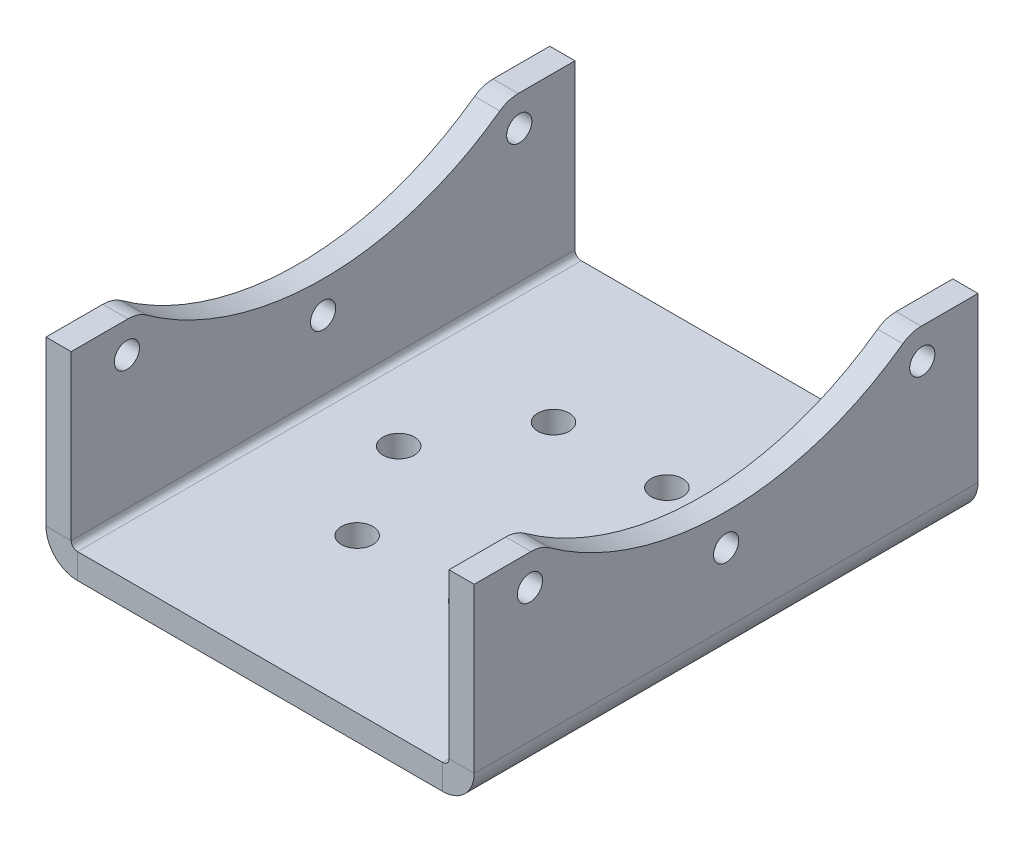
ISO-10303-21;
HEADER;
FILE_DESCRIPTION(('STEP AP214'),'2;1');
FILE_NAME('part.step','',(''),(''),'','','');
FILE_SCHEMA(('AUTOMOTIVE_DESIGN { 1 0 10303 214 1 1 1 1 }'));
ENDSEC;
DATA;
#1=APPLICATION_CONTEXT('core data for automotive mechanical design processes');
#2=APPLICATION_PROTOCOL_DEFINITION('international standard','automotive_design',2000,#1);
#3=PRODUCT_CONTEXT('',#1,'mechanical');
#4=PRODUCT('Part','Part','',(#3));
#5=PRODUCT_RELATED_PRODUCT_CATEGORY('part','',(#4));
#6=PRODUCT_DEFINITION_FORMATION('','',#4);
#7=PRODUCT_DEFINITION_CONTEXT('part definition',#1,'design');
#8=PRODUCT_DEFINITION('design','',#6,#7);
#9=PRODUCT_DEFINITION_SHAPE('','',#8);
#10=(LENGTH_UNIT() NAMED_UNIT(*) SI_UNIT(.MILLI.,.METRE.));
#11=(NAMED_UNIT(*) PLANE_ANGLE_UNIT() SI_UNIT($,.RADIAN.));
#12=(NAMED_UNIT(*) SI_UNIT($,.STERADIAN.) SOLID_ANGLE_UNIT());
#13=UNCERTAINTY_MEASURE_WITH_UNIT(LENGTH_MEASURE(1.E-05),#10,'distance_accuracy_value','');
#14=(GEOMETRIC_REPRESENTATION_CONTEXT(3) GLOBAL_UNCERTAINTY_ASSIGNED_CONTEXT((#13)) GLOBAL_UNIT_ASSIGNED_CONTEXT((#10,
#11,#12)) REPRESENTATION_CONTEXT('',''));
#15=CARTESIAN_POINT('',(0.,0.,0.));
#16=DIRECTION('',(0.,0.,1.));
#17=DIRECTION('',(1.,0.,0.));
#18=AXIS2_PLACEMENT_3D('',#15,#16,#17);
#19=CARTESIAN_POINT('',(-34.,27.,80.));
#20=DIRECTION('',(0.,1.,0.));
#21=DIRECTION('',(0.,0.,1.));
#22=AXIS2_PLACEMENT_3D('',#19,#20,#21);
#23=PLANE('',#22);
#24=DIRECTION('',(0.,0.,-1.));
#25=VECTOR('',#24,1.);
#26=CARTESIAN_POINT('',(-34.,27.,80.));
#27=LINE('',#26,#25);
#28=CARTESIAN_POINT('',(-34.,27.,9.01613323034062));
#29=VERTEX_POINT('',#28);
#30=CARTESIAN_POINT('',(-34.,27.,0.));
#31=VERTEX_POINT('',#30);
#32=EDGE_CURVE('E298',#29,#31,#27,.T.);
#33=ORIENTED_EDGE('',*,*,#32,.F.);
#34=DIRECTION('',(1.,0.,0.));
#35=VECTOR('',#34,1.);
#36=CARTESIAN_POINT('',(-30.,27.,9.01613323034061));
#37=LINE('',#36,#35);
#38=CARTESIAN_POINT('',(-30.,27.,9.01613323034062));
#39=VERTEX_POINT('',#38);
#40=EDGE_CURVE('E344',#29,#39,#37,.T.);
#41=ORIENTED_EDGE('',*,*,#40,.T.);
#42=DIRECTION('',(0.,0.,-1.));
#43=VECTOR('',#42,1.);
#44=CARTESIAN_POINT('',(-30.,27.,80.));
#45=LINE('',#44,#43);
#46=CARTESIAN_POINT('',(-30.,27.,0.));
#47=VERTEX_POINT('',#46);
#48=EDGE_CURVE('E196',#39,#47,#45,.T.);
#49=ORIENTED_EDGE('',*,*,#48,.T.);
#50=DIRECTION('',(1.,0.,0.));
#51=VECTOR('',#50,1.);
#52=CARTESIAN_POINT('',(-34.,27.,0.));
#53=LINE('',#52,#51);
#54=EDGE_CURVE('E236',#31,#47,#53,.T.);
#55=ORIENTED_EDGE('',*,*,#54,.F.);
#56=EDGE_LOOP('',(#33,#41,#49,#55));
#57=FACE_BOUND('',#56,.T.);
#58=ADVANCED_FACE('F36',(#57),#23,.T.);
#59=CARTESIAN_POINT('',(30.,27.,80.));
#60=DIRECTION('',(0.,1.,0.));
#61=DIRECTION('',(0.,0.,1.));
#62=AXIS2_PLACEMENT_3D('',#59,#60,#61);
#63=PLANE('',#62);
#64=DIRECTION('',(0.,0.,-1.));
#65=VECTOR('',#64,1.);
#66=CARTESIAN_POINT('',(30.,27.,80.));
#67=LINE('',#66,#65);
#68=CARTESIAN_POINT('',(30.,27.,9.0161332303406));
#69=VERTEX_POINT('',#68);
#70=CARTESIAN_POINT('',(30.,27.,0.));
#71=VERTEX_POINT('',#70);
#72=EDGE_CURVE('E279',#69,#71,#67,.T.);
#73=ORIENTED_EDGE('',*,*,#72,.F.);
#74=DIRECTION('',(1.,0.,0.));
#75=VECTOR('',#74,1.);
#76=CARTESIAN_POINT('',(34.,27.,9.0161332303406));
#77=LINE('',#76,#75);
#78=CARTESIAN_POINT('',(34.,27.,9.0161332303406));
#79=VERTEX_POINT('',#78);
#80=EDGE_CURVE('E61',#69,#79,#77,.T.);
#81=ORIENTED_EDGE('',*,*,#80,.T.);
#82=DIRECTION('',(0.,0.,-1.));
#83=VECTOR('',#82,1.);
#84=CARTESIAN_POINT('',(34.,27.,80.));
#85=LINE('',#84,#83);
#86=CARTESIAN_POINT('',(34.,27.,0.));
#87=VERTEX_POINT('',#86);
#88=EDGE_CURVE('E283',#79,#87,#85,.T.);
#89=ORIENTED_EDGE('',*,*,#88,.T.);
#90=DIRECTION('',(1.,0.,0.));
#91=VECTOR('',#90,1.);
#92=CARTESIAN_POINT('',(30.,27.,0.));
#93=LINE('',#92,#91);
#94=EDGE_CURVE('E255',#71,#87,#93,.T.);
#95=ORIENTED_EDGE('',*,*,#94,.F.);
#96=EDGE_LOOP('',(#73,#81,#89,#95));
#97=FACE_BOUND('',#96,.T.);
#98=ADVANCED_FACE('F426',(#97),#63,.T.);
#99=CARTESIAN_POINT('',(30.,1.00000000000001,80.));
#100=DIRECTION('',(0.,0.,1.));
#101=DIRECTION('',(1.,0.,0.));
#102=AXIS2_PLACEMENT_3D('',#99,#100,#101);
#103=PLANE('',#102);
#104=DIRECTION('',(1.,0.,0.));
#105=VECTOR('',#104,1.);
#106=CARTESIAN_POINT('',(30.,1.00000000000001,80.));
#107=LINE('',#106,#105);
#108=CARTESIAN_POINT('',(30.,1.00000000000001,80.));
#109=VERTEX_POINT('',#108);
#110=CARTESIAN_POINT('',(34.,1.00000000000001,80.));
#111=VERTEX_POINT('',#110);
#112=EDGE_CURVE('E312',#109,#111,#107,.T.);
#113=ORIENTED_EDGE('',*,*,#112,.F.);
#114=CARTESIAN_POINT('',(29.,1.00000000000001,80.));
#115=DIRECTION('',(0.,0.,1.));
#116=DIRECTION('',(1.,0.,0.));
#117=AXIS2_PLACEMENT_3D('',#114,#115,#116);
#118=CIRCLE('',#117,1.);
#119=CARTESIAN_POINT('',(29.,0.,80.));
#120=VERTEX_POINT('',#119);
#121=EDGE_CURVE('E224',#109,#120,#118,.F.);
#122=ORIENTED_EDGE('',*,*,#121,.T.);
#123=DIRECTION('',(0.,1.,0.));
#124=VECTOR('',#123,1.);
#125=CARTESIAN_POINT('',(29.,-3.99999999999999,80.));
#126=LINE('',#125,#124);
#127=CARTESIAN_POINT('',(29.,-3.99999999999999,80.));
#128=VERTEX_POINT('',#127);
#129=EDGE_CURVE('E310',#128,#120,#126,.T.);
#130=ORIENTED_EDGE('',*,*,#129,.F.);
#131=CARTESIAN_POINT('',(29.,1.00000000000001,80.));
#132=DIRECTION('',(0.,0.,1.));
#133=DIRECTION('',(1.,0.,0.));
#134=AXIS2_PLACEMENT_3D('',#131,#132,#133);
#135=CIRCLE('',#134,5.);
#136=EDGE_CURVE('E212',#111,#128,#135,.F.);
#137=ORIENTED_EDGE('',*,*,#136,.F.);
#138=EDGE_LOOP('',(#113,#122,#130,#137));
#139=FACE_BOUND('',#138,.T.);
#140=ADVANCED_FACE('F432',(#139),#103,.T.);
#141=CARTESIAN_POINT('',(29.,-3.99999999999999,80.));
#142=DIRECTION('',(0.,0.,1.));
#143=DIRECTION('',(1.,0.,0.));
#144=AXIS2_PLACEMENT_3D('',#141,#142,#143);
#145=PLANE('',#144);
#146=DIRECTION('',(0.,-1.,0.));
#147=VECTOR('',#146,1.);
#148=CARTESIAN_POINT('',(30.,0.,80.));
#149=LINE('',#148,#147);
#150=CARTESIAN_POINT('',(30.,27.,80.));
#151=VERTEX_POINT('',#150);
#152=EDGE_CURVE('E221',#151,#109,#149,.T.);
#153=ORIENTED_EDGE('',*,*,#152,.T.);
#154=ORIENTED_EDGE('',*,*,#112,.T.);
#155=DIRECTION('',(0.,1.,0.));
#156=VECTOR('',#155,1.);
#157=CARTESIAN_POINT('',(34.,0.,80.));
#158=LINE('',#157,#156);
#159=CARTESIAN_POINT('',(34.,27.,80.));
#160=VERTEX_POINT('',#159);
#161=EDGE_CURVE('E215',#160,#111,#158,.F.);
#162=ORIENTED_EDGE('',*,*,#161,.F.);
#163=DIRECTION('',(1.,0.,0.));
#164=VECTOR('',#163,1.);
#165=CARTESIAN_POINT('',(30.,27.,80.));
#166=LINE('',#165,#164);
#167=EDGE_CURVE('E218',#151,#160,#166,.T.);
#168=ORIENTED_EDGE('',*,*,#167,.F.);
#169=EDGE_LOOP('',(#153,#154,#162,#168));
#170=FACE_BOUND('',#169,.T.);
#171=ADVANCED_FACE('F472',(#170),#145,.T.);
#172=CARTESIAN_POINT('',(29.,0.,0.));
#173=DIRECTION('',(0.,0.,-1.));
#174=DIRECTION('',(-1.,0.,0.));
#175=AXIS2_PLACEMENT_3D('',#172,#173,#174);
#176=PLANE('',#175);
#177=DIRECTION('',(0.,-1.,0.));
#178=VECTOR('',#177,1.);
#179=CARTESIAN_POINT('',(29.,0.,0.));
#180=LINE('',#179,#178);
#181=CARTESIAN_POINT('',(29.,0.,0.));
#182=VERTEX_POINT('',#181);
#183=CARTESIAN_POINT('',(29.,-3.99999999999999,0.));
#184=VERTEX_POINT('',#183);
#185=EDGE_CURVE('E308',#182,#184,#180,.T.);
#186=ORIENTED_EDGE('',*,*,#185,.F.);
#187=CARTESIAN_POINT('',(29.,1.00000000000001,0.));
#188=DIRECTION('',(0.,0.,1.));
#189=DIRECTION('',(1.,0.,0.));
#190=AXIS2_PLACEMENT_3D('',#187,#188,#189);
#191=CIRCLE('',#190,1.);
#192=CARTESIAN_POINT('',(30.,1.00000000000001,0.));
#193=VERTEX_POINT('',#192);
#194=EDGE_CURVE('E261',#193,#182,#191,.F.);
#195=ORIENTED_EDGE('',*,*,#194,.F.);
#196=DIRECTION('',(-1.,0.,0.));
#197=VECTOR('',#196,1.);
#198=CARTESIAN_POINT('',(34.,1.00000000000001,0.));
#199=LINE('',#198,#197);
#200=CARTESIAN_POINT('',(34.,1.00000000000001,0.));
#201=VERTEX_POINT('',#200);
#202=EDGE_CURVE('E306',#201,#193,#199,.T.);
#203=ORIENTED_EDGE('',*,*,#202,.F.);
#204=CARTESIAN_POINT('',(29.,1.00000000000001,0.));
#205=DIRECTION('',(0.,0.,1.));
#206=DIRECTION('',(1.,0.,0.));
#207=AXIS2_PLACEMENT_3D('',#204,#205,#206);
#208=CIRCLE('',#207,5.);
#209=EDGE_CURVE('E249',#201,#184,#208,.F.);
#210=ORIENTED_EDGE('',*,*,#209,.T.);
#211=EDGE_LOOP('',(#186,#195,#203,#210));
#212=FACE_BOUND('',#211,.T.);
#213=ADVANCED_FACE('F468',(#212),#176,.T.);
#214=CARTESIAN_POINT('',(34.,1.00000000000001,0.));
#215=DIRECTION('',(0.,0.,-1.));
#216=DIRECTION('',(-1.,0.,0.));
#217=AXIS2_PLACEMENT_3D('',#214,#215,#216);
#218=PLANE('',#217);
#219=DIRECTION('',(-1.,0.,0.));
#220=VECTOR('',#219,1.);
#221=CARTESIAN_POINT('',(-30.,0.,0.));
#222=LINE('',#221,#220);
#223=CARTESIAN_POINT('',(-29.,0.,0.));
#224=VERTEX_POINT('',#223);
#225=EDGE_CURVE('E264',#182,#224,#222,.T.);
#226=ORIENTED_EDGE('',*,*,#225,.F.);
#227=ORIENTED_EDGE('',*,*,#185,.T.);
#228=DIRECTION('',(-1.,0.,0.));
#229=VECTOR('',#228,1.);
#230=CARTESIAN_POINT('',(-30.,-4.,0.));
#231=LINE('',#230,#229);
#232=CARTESIAN_POINT('',(-29.,-4.,0.));
#233=VERTEX_POINT('',#232);
#234=EDGE_CURVE('E246',#184,#233,#231,.T.);
#235=ORIENTED_EDGE('',*,*,#234,.T.);
#236=DIRECTION('',(0.,1.,0.));
#237=VECTOR('',#236,1.);
#238=CARTESIAN_POINT('',(-29.,-4.,0.));
#239=LINE('',#238,#237);
#240=EDGE_CURVE('E195',#233,#224,#239,.T.);
#241=ORIENTED_EDGE('',*,*,#240,.T.);
#242=EDGE_LOOP('',(#226,#227,#235,#241));
#243=FACE_BOUND('',#242,.T.);
#244=ADVANCED_FACE('F464',(#243),#218,.T.);
#245=CARTESIAN_POINT('',(-29.,0.,80.));
#246=DIRECTION('',(0.,0.,1.));
#247=DIRECTION('',(1.,0.,0.));
#248=AXIS2_PLACEMENT_3D('',#245,#246,#247);
#249=PLANE('',#248);
#250=DIRECTION('',(0.,-1.,0.));
#251=VECTOR('',#250,1.);
#252=CARTESIAN_POINT('',(-29.,0.,80.));
#253=LINE('',#252,#251);
#254=CARTESIAN_POINT('',(-29.,0.,80.));
#255=VERTEX_POINT('',#254);
#256=CARTESIAN_POINT('',(-29.,-4.,80.));
#257=VERTEX_POINT('',#256);
#258=EDGE_CURVE('E304',#255,#257,#253,.T.);
#259=ORIENTED_EDGE('',*,*,#258,.F.);
#260=CARTESIAN_POINT('',(-29.,1.,80.));
#261=DIRECTION('',(0.,0.,1.));
#262=DIRECTION('',(1.,0.,0.));
#263=AXIS2_PLACEMENT_3D('',#260,#261,#262);
#264=CIRCLE('',#263,1.);
#265=CARTESIAN_POINT('',(-30.,1.,80.));
#266=VERTEX_POINT('',#265);
#267=EDGE_CURVE('E230',#255,#266,#264,.F.);
#268=ORIENTED_EDGE('',*,*,#267,.T.);
#269=DIRECTION('',(1.,0.,0.));
#270=VECTOR('',#269,1.);
#271=CARTESIAN_POINT('',(-34.,1.,80.));
#272=LINE('',#271,#270);
#273=CARTESIAN_POINT('',(-34.,1.,80.));
#274=VERTEX_POINT('',#273);
#275=EDGE_CURVE('E182',#274,#266,#272,.T.);
#276=ORIENTED_EDGE('',*,*,#275,.F.);
#277=CARTESIAN_POINT('',(-29.,1.,80.));
#278=DIRECTION('',(0.,0.,1.));
#279=DIRECTION('',(1.,0.,0.));
#280=AXIS2_PLACEMENT_3D('',#277,#278,#279);
#281=CIRCLE('',#280,5.);
#282=EDGE_CURVE('E203',#257,#274,#281,.F.);
#283=ORIENTED_EDGE('',*,*,#282,.F.);
#284=EDGE_LOOP('',(#259,#268,#276,#283));
#285=FACE_BOUND('',#284,.T.);
#286=ADVANCED_FACE('F460',(#285),#249,.T.);
#287=CARTESIAN_POINT('',(-34.,1.,80.));
#288=DIRECTION('',(0.,0.,1.));
#289=DIRECTION('',(1.,0.,0.));
#290=AXIS2_PLACEMENT_3D('',#287,#288,#289);
#291=PLANE('',#290);
#292=DIRECTION('',(-1.,0.,0.));
#293=VECTOR('',#292,1.);
#294=CARTESIAN_POINT('',(-30.,0.,80.));
#295=LINE('',#294,#293);
#296=EDGE_CURVE('E227',#120,#255,#295,.T.);
#297=ORIENTED_EDGE('',*,*,#296,.T.);
#298=ORIENTED_EDGE('',*,*,#258,.T.);
#299=DIRECTION('',(-1.,0.,0.));
#300=VECTOR('',#299,1.);
#301=CARTESIAN_POINT('',(-30.,-4.,80.));
#302=LINE('',#301,#300);
#303=EDGE_CURVE('E209',#128,#257,#302,.T.);
#304=ORIENTED_EDGE('',*,*,#303,.F.);
#305=ORIENTED_EDGE('',*,*,#129,.T.);
#306=EDGE_LOOP('',(#297,#298,#304,#305));
#307=FACE_BOUND('',#306,.T.);
#308=ADVANCED_FACE('F456',(#307),#291,.T.);
#309=CARTESIAN_POINT('',(-30.,1.,0.));
#310=DIRECTION('',(0.,0.,-1.));
#311=DIRECTION('',(-1.,0.,0.));
#312=AXIS2_PLACEMENT_3D('',#309,#310,#311);
#313=PLANE('',#312);
#314=DIRECTION('',(-1.,0.,0.));
#315=VECTOR('',#314,1.);
#316=CARTESIAN_POINT('',(-30.,1.,0.));
#317=LINE('',#316,#315);
#318=CARTESIAN_POINT('',(-30.,1.,0.));
#319=VERTEX_POINT('',#318);
#320=CARTESIAN_POINT('',(-34.,1.,0.));
#321=VERTEX_POINT('',#320);
#322=EDGE_CURVE('E301',#319,#321,#317,.T.);
#323=ORIENTED_EDGE('',*,*,#322,.F.);
#324=CARTESIAN_POINT('',(-29.,1.,0.));
#325=DIRECTION('',(0.,0.,1.));
#326=DIRECTION('',(1.,0.,0.));
#327=AXIS2_PLACEMENT_3D('',#324,#325,#326);
#328=CIRCLE('',#327,1.);
#329=EDGE_CURVE('E186',#224,#319,#328,.F.);
#330=ORIENTED_EDGE('',*,*,#329,.F.);
#331=ORIENTED_EDGE('',*,*,#240,.F.);
#332=CARTESIAN_POINT('',(-29.,1.,0.));
#333=DIRECTION('',(0.,0.,1.));
#334=DIRECTION('',(1.,0.,0.));
#335=AXIS2_PLACEMENT_3D('',#332,#333,#334);
#336=CIRCLE('',#335,5.);
#337=EDGE_CURVE('E243',#233,#321,#336,.F.);
#338=ORIENTED_EDGE('',*,*,#337,.T.);
#339=EDGE_LOOP('',(#323,#330,#331,#338));
#340=FACE_BOUND('',#339,.T.);
#341=ADVANCED_FACE('F450',(#340),#313,.T.);
#342=CARTESIAN_POINT('',(-29.,-4.,0.));
#343=DIRECTION('',(0.,0.,-1.));
#344=DIRECTION('',(-1.,0.,0.));
#345=AXIS2_PLACEMENT_3D('',#342,#343,#344);
#346=PLANE('',#345);
#347=DIRECTION('',(0.,1.,0.));
#348=VECTOR('',#347,1.);
#349=CARTESIAN_POINT('',(-30.,0.,0.));
#350=LINE('',#349,#348);
#351=EDGE_CURVE('E233',#319,#47,#350,.T.);
#352=ORIENTED_EDGE('',*,*,#351,.F.);
#353=ORIENTED_EDGE('',*,*,#322,.T.);
#354=DIRECTION('',(0.,1.,0.));
#355=VECTOR('',#354,1.);
#356=CARTESIAN_POINT('',(-34.,0.,0.));
#357=LINE('',#356,#355);
#358=EDGE_CURVE('E240',#321,#31,#357,.T.);
#359=ORIENTED_EDGE('',*,*,#358,.T.);
#360=ORIENTED_EDGE('',*,*,#54,.T.);
#361=EDGE_LOOP('',(#352,#353,#359,#360));
#362=FACE_BOUND('',#361,.T.);
#363=ADVANCED_FACE('F446',(#362),#346,.T.);
#364=CARTESIAN_POINT('',(-30.,0.,80.));
#365=DIRECTION('',(-1.,0.,0.));
#366=DIRECTION('',(0.,0.,1.));
#367=AXIS2_PLACEMENT_3D('',#364,#365,#366);
#368=PLANE('',#367);
#369=CARTESIAN_POINT('',(-30.,22.1220992981278,71.1526183715011));
#370=DIRECTION('',(-1.,0.,0.));
#371=DIRECTION('',(0.,0.,1.));
#372=AXIS2_PLACEMENT_3D('',#369,#370,#371);
#373=CIRCLE('',#372,2.);
#374=CARTESIAN_POINT('',(-30.,22.1220992981278,73.1526183715011));
#375=VERTEX_POINT('',#374);
#376=EDGE_CURVE('E237',#375,#375,#373,.T.);
#377=ORIENTED_EDGE('',*,*,#376,.T.);
#378=EDGE_LOOP('',(#377));
#379=FACE_BOUND('',#378,.T.);
#380=CARTESIAN_POINT('',(-30.,22.1220992981278,8.84738162849893));
#381=DIRECTION('',(-1.,0.,0.));
#382=DIRECTION('',(0.,0.,1.));
#383=AXIS2_PLACEMENT_3D('',#380,#381,#382);
#384=CIRCLE('',#383,2.00000000000001);
#385=CARTESIAN_POINT('',(-30.,22.1220992981278,10.8473816284989));
#386=VERTEX_POINT('',#385);
#387=EDGE_CURVE('E326',#386,#386,#384,.T.);
#388=ORIENTED_EDGE('',*,*,#387,.T.);
#389=EDGE_LOOP('',(#388));
#390=FACE_BOUND('',#389,.T.);
#391=CARTESIAN_POINT('',(-30.,12.,40.));
#392=DIRECTION('',(-1.,0.,0.));
#393=DIRECTION('',(0.,0.,1.));
#394=AXIS2_PLACEMENT_3D('',#391,#392,#393);
#395=CIRCLE('',#394,1.99999999999998);
#396=CARTESIAN_POINT('',(-30.,12.,42.));
#397=VERTEX_POINT('',#396);
#398=EDGE_CURVE('E321',#397,#397,#395,.T.);
#399=ORIENTED_EDGE('',*,*,#398,.T.);
#400=EDGE_LOOP('',(#399));
#401=FACE_BOUND('',#400,.T.);
#402=CARTESIAN_POINT('',(-30.,65.,40.));
#403=DIRECTION('',(-1.,0.,0.));
#404=DIRECTION('',(0.,0.,1.));
#405=AXIS2_PLACEMENT_3D('',#402,#403,#404);
#406=CIRCLE('',#405,48.);
#407=CARTESIAN_POINT('',(-30.,26.0566037735849,11.9391395293651));
#408=VERTEX_POINT('',#407);
#409=CARTESIAN_POINT('',(-30.,26.0566037735849,68.0608604706349));
#410=VERTEX_POINT('',#409);
#411=EDGE_CURVE('E322',#408,#410,#406,.T.);
#412=ORIENTED_EDGE('',*,*,#411,.T.);
#413=CARTESIAN_POINT('',(-30.,22.,70.9838667696594));
#414=DIRECTION('',(-1.,0.,0.));
#415=DIRECTION('',(0.,0.,1.));
#416=AXIS2_PLACEMENT_3D('',#413,#414,#415);
#417=CIRCLE('',#416,5.);
#418=CARTESIAN_POINT('',(-30.,27.,70.9838667696594));
#419=VERTEX_POINT('',#418);
#420=EDGE_CURVE('E192',#410,#419,#417,.F.);
#421=ORIENTED_EDGE('',*,*,#420,.T.);
#422=CARTESIAN_POINT('',(-30.,27.,80.));
#423=VERTEX_POINT('',#422);
#424=EDGE_CURVE('E189',#423,#419,#45,.T.);
#425=ORIENTED_EDGE('',*,*,#424,.F.);
#426=DIRECTION('',(0.,1.,0.));
#427=VECTOR('',#426,1.);
#428=CARTESIAN_POINT('',(-30.,0.,80.));
#429=LINE('',#428,#427);
#430=EDGE_CURVE('E175',#266,#423,#429,.T.);
#431=ORIENTED_EDGE('',*,*,#430,.F.);
#432=DIRECTION('',(0.,0.,-1.));
#433=VECTOR('',#432,1.);
#434=CARTESIAN_POINT('',(-30.,1.,80.));
#435=LINE('',#434,#433);
#436=EDGE_CURVE('E232',#266,#319,#435,.T.);
#437=ORIENTED_EDGE('',*,*,#436,.T.);
#438=ORIENTED_EDGE('',*,*,#351,.T.);
#439=ORIENTED_EDGE('',*,*,#48,.F.);
#440=CARTESIAN_POINT('',(-30.,22.,9.01613323034061));
#441=DIRECTION('',(-1.,0.,0.));
#442=DIRECTION('',(0.,0.,1.));
#443=AXIS2_PLACEMENT_3D('',#440,#441,#442);
#444=CIRCLE('',#443,5.);
#445=EDGE_CURVE('E335',#39,#408,#444,.F.);
#446=ORIENTED_EDGE('',*,*,#445,.T.);
#447=EDGE_LOOP('',(#412,#421,#425,#431,#437,#438,#439,#446));
#448=FACE_BOUND('',#447,.T.);
#449=ADVANCED_FACE('F191',(#379,#390,#401,#448),#368,.F.);
#450=ORIENTED_EDGE('',*,*,#424,.T.);
#451=DIRECTION('',(1.,0.,0.));
#452=VECTOR('',#451,1.);
#453=CARTESIAN_POINT('',(-34.,27.,70.9838667696594));
#454=LINE('',#453,#452);
#455=CARTESIAN_POINT('',(-34.,27.,70.9838667696594));
#456=VERTEX_POINT('',#455);
#457=EDGE_CURVE('E338',#419,#456,#454,.F.);
#458=ORIENTED_EDGE('',*,*,#457,.T.);
#459=CARTESIAN_POINT('',(-34.,27.,80.));
#460=VERTEX_POINT('',#459);
#461=EDGE_CURVE('E200',#460,#456,#27,.T.);
#462=ORIENTED_EDGE('',*,*,#461,.F.);
#463=DIRECTION('',(1.,0.,0.));
#464=VECTOR('',#463,1.);
#465=CARTESIAN_POINT('',(-34.,27.,80.));
#466=LINE('',#465,#464);
#467=EDGE_CURVE('E180',#460,#423,#466,.T.);
#468=ORIENTED_EDGE('',*,*,#467,.T.);
#469=EDGE_LOOP('',(#450,#458,#462,#468));
#470=FACE_BOUND('',#469,.T.);
#471=ADVANCED_FACE('F198',(#470),#23,.T.);
#472=CARTESIAN_POINT('',(-34.,0.,80.));
#473=DIRECTION('',(-1.,0.,0.));
#474=DIRECTION('',(0.,0.,1.));
#475=AXIS2_PLACEMENT_3D('',#472,#473,#474);
#476=PLANE('',#475);
#477=CARTESIAN_POINT('',(-34.,22.1220992981278,71.1526183715011));
#478=DIRECTION('',(-1.,0.,0.));
#479=DIRECTION('',(0.,0.,1.));
#480=AXIS2_PLACEMENT_3D('',#477,#478,#479);
#481=CIRCLE('',#480,2.);
#482=CARTESIAN_POINT('',(-34.,22.1220992981278,73.1526183715011));
#483=VERTEX_POINT('',#482);
#484=EDGE_CURVE('E376',#483,#483,#481,.T.);
#485=ORIENTED_EDGE('',*,*,#484,.F.);
#486=EDGE_LOOP('',(#485));
#487=FACE_BOUND('',#486,.T.);
#488=CARTESIAN_POINT('',(-34.,22.1220992981278,8.84738162849893));
#489=DIRECTION('',(-1.,0.,0.));
#490=DIRECTION('',(0.,0.,1.));
#491=AXIS2_PLACEMENT_3D('',#488,#489,#490);
#492=CIRCLE('',#491,2.00000000000001);
#493=CARTESIAN_POINT('',(-34.,22.1220992981278,10.8473816284989));
#494=VERTEX_POINT('',#493);
#495=EDGE_CURVE('E385',#494,#494,#492,.T.);
#496=ORIENTED_EDGE('',*,*,#495,.F.);
#497=EDGE_LOOP('',(#496));
#498=FACE_BOUND('',#497,.T.);
#499=CARTESIAN_POINT('',(-34.,12.,40.));
#500=DIRECTION('',(-1.,0.,0.));
#501=DIRECTION('',(0.,0.,1.));
#502=AXIS2_PLACEMENT_3D('',#499,#500,#501);
#503=CIRCLE('',#502,1.99999999999998);
#504=CARTESIAN_POINT('',(-34.,12.,42.));
#505=VERTEX_POINT('',#504);
#506=EDGE_CURVE('E950',#505,#505,#503,.T.);
#507=ORIENTED_EDGE('',*,*,#506,.F.);
#508=EDGE_LOOP('',(#507));
#509=FACE_BOUND('',#508,.T.);
#510=ORIENTED_EDGE('',*,*,#461,.T.);
#511=CARTESIAN_POINT('',(-34.,22.,70.9838667696594));
#512=DIRECTION('',(-1.,0.,0.));
#513=DIRECTION('',(0.,0.,1.));
#514=AXIS2_PLACEMENT_3D('',#511,#512,#513);
#515=CIRCLE('',#514,5.);
#516=CARTESIAN_POINT('',(-34.,26.0566037735849,68.0608604706349));
#517=VERTEX_POINT('',#516);
#518=EDGE_CURVE('E342',#456,#517,#515,.T.);
#519=ORIENTED_EDGE('',*,*,#518,.T.);
#520=CARTESIAN_POINT('',(-34.,65.,40.));
#521=DIRECTION('',(-1.,0.,0.));
#522=DIRECTION('',(0.,0.,1.));
#523=AXIS2_PLACEMENT_3D('',#520,#521,#522);
#524=CIRCLE('',#523,48.);
#525=CARTESIAN_POINT('',(-34.,26.0566037735849,11.9391395293651));
#526=VERTEX_POINT('',#525);
#527=EDGE_CURVE('E391',#526,#517,#524,.T.);
#528=ORIENTED_EDGE('',*,*,#527,.F.);
#529=CARTESIAN_POINT('',(-34.,22.,9.01613323034061));
#530=DIRECTION('',(-1.,0.,0.));
#531=DIRECTION('',(0.,0.,1.));
#532=AXIS2_PLACEMENT_3D('',#529,#530,#531);
#533=CIRCLE('',#532,5.);
#534=EDGE_CURVE('E340',#526,#29,#533,.T.);
#535=ORIENTED_EDGE('',*,*,#534,.T.);
#536=ORIENTED_EDGE('',*,*,#32,.T.);
#537=ORIENTED_EDGE('',*,*,#358,.F.);
#538=DIRECTION('',(0.,0.,-1.));
#539=VECTOR('',#538,1.);
#540=CARTESIAN_POINT('',(-34.,1.,80.));
#541=LINE('',#540,#539);
#542=EDGE_CURVE('E295',#274,#321,#541,.T.);
#543=ORIENTED_EDGE('',*,*,#542,.F.);
#544=DIRECTION('',(0.,1.,0.));
#545=VECTOR('',#544,1.);
#546=CARTESIAN_POINT('',(-34.,0.,80.));
#547=LINE('',#546,#545);
#548=EDGE_CURVE('E201',#274,#460,#547,.T.);
#549=ORIENTED_EDGE('',*,*,#548,.T.);
#550=EDGE_LOOP('',(#510,#519,#528,#535,#536,#537,#543,#549));
#551=FACE_BOUND('',#550,.T.);
#552=ADVANCED_FACE('F439',(#487,#498,#509,#551),#476,.T.);
#553=CARTESIAN_POINT('',(-29.,1.,80.));
#554=DIRECTION('',(0.,0.,-1.));
#555=DIRECTION('',(-1.,0.,0.));
#556=AXIS2_PLACEMENT_3D('',#553,#554,#555);
#557=CYLINDRICAL_SURFACE('',#556,5.);
#558=ORIENTED_EDGE('',*,*,#337,.F.);
#559=DIRECTION('',(0.,0.,-1.));
#560=VECTOR('',#559,1.);
#561=CARTESIAN_POINT('',(-29.,-4.,80.));
#562=LINE('',#561,#560);
#563=EDGE_CURVE('E292',#257,#233,#562,.T.);
#564=ORIENTED_EDGE('',*,*,#563,.F.);
#565=ORIENTED_EDGE('',*,*,#282,.T.);
#566=ORIENTED_EDGE('',*,*,#542,.T.);
#567=EDGE_LOOP('',(#558,#564,#565,#566));
#568=FACE_BOUND('',#567,.T.);
#569=ADVANCED_FACE('F444',(#568),#557,.T.);
#570=CARTESIAN_POINT('',(-30.,-4.,80.));
#571=DIRECTION('',(0.,-1.,0.));
#572=DIRECTION('',(1.,0.,0.));
#573=AXIS2_PLACEMENT_3D('',#570,#571,#572);
#574=PLANE('',#573);
#575=CARTESIAN_POINT('',(-18.,-4.,40.));
#576=DIRECTION('',(0.,-1.,0.));
#577=DIRECTION('',(1.,0.,0.));
#578=AXIS2_PLACEMENT_3D('',#575,#576,#577);
#579=CIRCLE('',#578,2.5);
#580=CARTESIAN_POINT('',(-15.5,-4.,40.));
#581=VERTEX_POINT('',#580);
#582=EDGE_CURVE('E363',#581,#581,#579,.T.);
#583=ORIENTED_EDGE('',*,*,#582,.F.);
#584=EDGE_LOOP('',(#583));
#585=FACE_BOUND('',#584,.T.);
#586=CARTESIAN_POINT('',(8.99999999999999,-3.99999999999999,55.5884572681199));
#587=DIRECTION('',(0.,-1.,0.));
#588=DIRECTION('',(1.,0.,0.));
#589=AXIS2_PLACEMENT_3D('',#586,#587,#588);
#590=CIRCLE('',#589,2.5);
#591=CARTESIAN_POINT('',(11.5,-3.99999999999999,55.5884572681199));
#592=VERTEX_POINT('',#591);
#593=EDGE_CURVE('E937',#592,#592,#590,.T.);
#594=ORIENTED_EDGE('',*,*,#593,.F.);
#595=EDGE_LOOP('',(#594));
#596=FACE_BOUND('',#595,.T.);
#597=CARTESIAN_POINT('',(-8.99999999999998,-4.,24.4115427318801));
#598=DIRECTION('',(0.,-1.,0.));
#599=DIRECTION('',(1.,0.,0.));
#600=AXIS2_PLACEMENT_3D('',#597,#598,#599);
#601=CIRCLE('',#600,2.5);
#602=CARTESIAN_POINT('',(-6.49999999999998,-4.,24.4115427318801));
#603=VERTEX_POINT('',#602);
#604=EDGE_CURVE('E939',#603,#603,#601,.T.);
#605=ORIENTED_EDGE('',*,*,#604,.F.);
#606=EDGE_LOOP('',(#605));
#607=FACE_BOUND('',#606,.T.);
#608=CARTESIAN_POINT('',(9.00000000000001,-3.99999999999999,24.4115427318801));
#609=DIRECTION('',(0.,-1.,0.));
#610=DIRECTION('',(1.,0.,0.));
#611=AXIS2_PLACEMENT_3D('',#608,#609,#610);
#612=CIRCLE('',#611,2.5);
#613=CARTESIAN_POINT('',(11.5,-3.99999999999999,24.4115427318801));
#614=VERTEX_POINT('',#613);
#615=EDGE_CURVE('E943',#614,#614,#612,.T.);
#616=ORIENTED_EDGE('',*,*,#615,.F.);
#617=EDGE_LOOP('',(#616));
#618=FACE_BOUND('',#617,.T.);
#619=CARTESIAN_POINT('',(18.,-3.99999999999999,40.));
#620=DIRECTION('',(0.,-1.,0.));
#621=DIRECTION('',(1.,0.,0.));
#622=AXIS2_PLACEMENT_3D('',#619,#620,#621);
#623=CIRCLE('',#622,2.5);
#624=CARTESIAN_POINT('',(20.5,-3.99999999999999,40.));
#625=VERTEX_POINT('',#624);
#626=EDGE_CURVE('E934',#625,#625,#623,.T.);
#627=ORIENTED_EDGE('',*,*,#626,.F.);
#628=EDGE_LOOP('',(#627));
#629=FACE_BOUND('',#628,.T.);
#630=CARTESIAN_POINT('',(-9.00000000000001,-4.,55.5884572681199));
#631=DIRECTION('',(0.,-1.,0.));
#632=DIRECTION('',(1.,0.,0.));
#633=AXIS2_PLACEMENT_3D('',#630,#631,#632);
#634=CIRCLE('',#633,2.5);
#635=CARTESIAN_POINT('',(-6.5,-4.,55.5884572681199));
#636=VERTEX_POINT('',#635);
#637=EDGE_CURVE('E931',#636,#636,#634,.T.);
#638=ORIENTED_EDGE('',*,*,#637,.F.);
#639=EDGE_LOOP('',(#638));
#640=FACE_BOUND('',#639,.T.);
#641=ORIENTED_EDGE('',*,*,#234,.F.);
#642=DIRECTION('',(0.,0.,-1.));
#643=VECTOR('',#642,1.);
#644=CARTESIAN_POINT('',(29.,-3.99999999999999,80.));
#645=LINE('',#644,#643);
#646=EDGE_CURVE('E289',#128,#184,#645,.T.);
#647=ORIENTED_EDGE('',*,*,#646,.F.);
#648=ORIENTED_EDGE('',*,*,#303,.T.);
#649=ORIENTED_EDGE('',*,*,#563,.T.);
#650=EDGE_LOOP('',(#641,#647,#648,#649));
#651=FACE_BOUND('',#650,.T.);
#652=ADVANCED_FACE('F586',(#585,#596,#607,#618,#629,#640,#651),#574,.T.);
#653=CARTESIAN_POINT('',(29.,1.00000000000001,80.));
#654=DIRECTION('',(0.,0.,-1.));
#655=DIRECTION('',(-1.,0.,0.));
#656=AXIS2_PLACEMENT_3D('',#653,#654,#655);
#657=CYLINDRICAL_SURFACE('',#656,5.);
#658=ORIENTED_EDGE('',*,*,#209,.F.);
#659=DIRECTION('',(0.,0.,-1.));
#660=VECTOR('',#659,1.);
#661=CARTESIAN_POINT('',(34.,1.00000000000001,80.));
#662=LINE('',#661,#660);
#663=EDGE_CURVE('E286',#111,#201,#662,.T.);
#664=ORIENTED_EDGE('',*,*,#663,.F.);
#665=ORIENTED_EDGE('',*,*,#136,.T.);
#666=ORIENTED_EDGE('',*,*,#646,.T.);
#667=EDGE_LOOP('',(#658,#664,#665,#666));
#668=FACE_BOUND('',#667,.T.);
#669=ADVANCED_FACE('F513',(#668),#657,.T.);
#670=CARTESIAN_POINT('',(34.,0.,80.));
#671=DIRECTION('',(1.,0.,0.));
#672=DIRECTION('',(0.,0.,-1.));
#673=AXIS2_PLACEMENT_3D('',#670,#671,#672);
#674=PLANE('',#673);
#675=CARTESIAN_POINT('',(34.,22.1220992981278,71.1526183715011));
#676=DIRECTION('',(-1.,0.,0.));
#677=DIRECTION('',(0.,0.,1.));
#678=AXIS2_PLACEMENT_3D('',#675,#676,#677);
#679=CIRCLE('',#678,2.);
#680=CARTESIAN_POINT('',(34.,22.1220992981278,73.1526183715011));
#681=VERTEX_POINT('',#680);
#682=EDGE_CURVE('E380',#681,#681,#679,.T.);
#683=ORIENTED_EDGE('',*,*,#682,.T.);
#684=EDGE_LOOP('',(#683));
#685=FACE_BOUND('',#684,.T.);
#686=CARTESIAN_POINT('',(34.,22.1220992981278,8.84738162849893));
#687=DIRECTION('',(-1.,0.,0.));
#688=DIRECTION('',(0.,0.,1.));
#689=AXIS2_PLACEMENT_3D('',#686,#687,#688);
#690=CIRCLE('',#689,2.00000000000001);
#691=CARTESIAN_POINT('',(34.,22.1220992981278,10.8473816284989));
#692=VERTEX_POINT('',#691);
#693=EDGE_CURVE('E953',#692,#692,#690,.T.);
#694=ORIENTED_EDGE('',*,*,#693,.T.);
#695=EDGE_LOOP('',(#694));
#696=FACE_BOUND('',#695,.T.);
#697=CARTESIAN_POINT('',(34.,12.,40.));
#698=DIRECTION('',(-1.,0.,0.));
#699=DIRECTION('',(0.,0.,1.));
#700=AXIS2_PLACEMENT_3D('',#697,#698,#699);
#701=CIRCLE('',#700,1.99999999999998);
#702=CARTESIAN_POINT('',(34.,12.,42.));
#703=VERTEX_POINT('',#702);
#704=EDGE_CURVE('E394',#703,#703,#701,.T.);
#705=ORIENTED_EDGE('',*,*,#704,.T.);
#706=EDGE_LOOP('',(#705));
#707=FACE_BOUND('',#706,.T.);
#708=ORIENTED_EDGE('',*,*,#88,.F.);
#709=CARTESIAN_POINT('',(34.,22.,9.0161332303406));
#710=DIRECTION('',(1.,0.,0.));
#711=DIRECTION('',(0.,0.,-1.));
#712=AXIS2_PLACEMENT_3D('',#709,#710,#711);
#713=CIRCLE('',#712,5.);
#714=CARTESIAN_POINT('',(34.,26.0566037735849,11.9391395293651));
#715=VERTEX_POINT('',#714);
#716=EDGE_CURVE('E45',#79,#715,#713,.T.);
#717=ORIENTED_EDGE('',*,*,#716,.T.);
#718=CARTESIAN_POINT('',(34.,65.,40.));
#719=DIRECTION('',(-1.,0.,0.));
#720=DIRECTION('',(0.,0.,1.));
#721=AXIS2_PLACEMENT_3D('',#718,#719,#720);
#722=CIRCLE('',#721,48.);
#723=CARTESIAN_POINT('',(34.,26.0566037735849,68.0608604706349));
#724=VERTEX_POINT('',#723);
#725=EDGE_CURVE('E389',#715,#724,#722,.T.);
#726=ORIENTED_EDGE('',*,*,#725,.T.);
#727=CARTESIAN_POINT('',(34.,22.,70.9838667696594));
#728=DIRECTION('',(1.,0.,0.));
#729=DIRECTION('',(0.,0.,-1.));
#730=AXIS2_PLACEMENT_3D('',#727,#728,#729);
#731=CIRCLE('',#730,5.);
#732=CARTESIAN_POINT('',(34.,27.,70.9838667696594));
#733=VERTEX_POINT('',#732);
#734=EDGE_CURVE('E53',#724,#733,#731,.T.);
#735=ORIENTED_EDGE('',*,*,#734,.T.);
#736=EDGE_CURVE('E284',#160,#733,#85,.T.);
#737=ORIENTED_EDGE('',*,*,#736,.F.);
#738=ORIENTED_EDGE('',*,*,#161,.T.);
#739=ORIENTED_EDGE('',*,*,#663,.T.);
#740=DIRECTION('',(0.,1.,0.));
#741=VECTOR('',#740,1.);
#742=CARTESIAN_POINT('',(34.,0.,0.));
#743=LINE('',#742,#741);
#744=EDGE_CURVE('E252',#87,#201,#743,.F.);
#745=ORIENTED_EDGE('',*,*,#744,.F.);
#746=EDGE_LOOP('',(#708,#717,#726,#735,#737,#738,#739,#745));
#747=FACE_BOUND('',#746,.T.);
#748=ADVANCED_FACE('F493',(#685,#696,#707,#747),#674,.T.);
#749=ORIENTED_EDGE('',*,*,#736,.T.);
#750=DIRECTION('',(1.,0.,0.));
#751=VECTOR('',#750,1.);
#752=CARTESIAN_POINT('',(30.,27.,70.9838667696594));
#753=LINE('',#752,#751);
#754=CARTESIAN_POINT('',(30.,27.,70.9838667696594));
#755=VERTEX_POINT('',#754);
#756=EDGE_CURVE('E11',#733,#755,#753,.F.);
#757=ORIENTED_EDGE('',*,*,#756,.T.);
#758=EDGE_CURVE('E280',#151,#755,#67,.T.);
#759=ORIENTED_EDGE('',*,*,#758,.F.);
#760=ORIENTED_EDGE('',*,*,#167,.T.);
#761=EDGE_LOOP('',(#749,#757,#759,#760));
#762=FACE_BOUND('',#761,.T.);
#763=ADVANCED_FACE('F434',(#762),#63,.T.);
#764=CARTESIAN_POINT('',(30.,0.,80.));
#765=DIRECTION('',(1.,0.,0.));
#766=DIRECTION('',(0.,0.,-1.));
#767=AXIS2_PLACEMENT_3D('',#764,#765,#766);
#768=PLANE('',#767);
#769=CARTESIAN_POINT('',(30.,22.1220992981278,71.1526183715011));
#770=DIRECTION('',(1.,0.,0.));
#771=DIRECTION('',(0.,0.,-1.));
#772=AXIS2_PLACEMENT_3D('',#769,#770,#771);
#773=CIRCLE('',#772,2.);
#774=CARTESIAN_POINT('',(30.,22.1220992981278,69.1526183715011));
#775=VERTEX_POINT('',#774);
#776=EDGE_CURVE('E327',#775,#775,#773,.T.);
#777=ORIENTED_EDGE('',*,*,#776,.T.);
#778=EDGE_LOOP('',(#777));
#779=FACE_BOUND('',#778,.T.);
#780=CARTESIAN_POINT('',(30.,22.1220992981278,8.84738162849893));
#781=DIRECTION('',(1.,0.,0.));
#782=DIRECTION('',(0.,0.,-1.));
#783=AXIS2_PLACEMENT_3D('',#780,#781,#782);
#784=CIRCLE('',#783,2.00000000000001);
#785=CARTESIAN_POINT('',(30.,22.1220992981278,6.84738162849891));
#786=VERTEX_POINT('',#785);
#787=EDGE_CURVE('E323',#786,#786,#784,.T.);
#788=ORIENTED_EDGE('',*,*,#787,.T.);
#789=EDGE_LOOP('',(#788));
#790=FACE_BOUND('',#789,.T.);
#791=CARTESIAN_POINT('',(30.,12.,40.));
#792=DIRECTION('',(1.,0.,0.));
#793=DIRECTION('',(0.,0.,-1.));
#794=AXIS2_PLACEMENT_3D('',#791,#792,#793);
#795=CIRCLE('',#794,1.99999999999998);
#796=CARTESIAN_POINT('',(30.,12.,38.));
#797=VERTEX_POINT('',#796);
#798=EDGE_CURVE('E318',#797,#797,#795,.T.);
#799=ORIENTED_EDGE('',*,*,#798,.T.);
#800=EDGE_LOOP('',(#799));
#801=FACE_BOUND('',#800,.T.);
#802=CARTESIAN_POINT('',(30.,65.,40.));
#803=DIRECTION('',(1.,0.,0.));
#804=DIRECTION('',(0.,0.,-1.));
#805=AXIS2_PLACEMENT_3D('',#802,#803,#804);
#806=CIRCLE('',#805,48.);
#807=CARTESIAN_POINT('',(30.,26.0566037735849,68.0608604706349));
#808=VERTEX_POINT('',#807);
#809=CARTESIAN_POINT('',(30.,26.0566037735849,11.9391395293651));
#810=VERTEX_POINT('',#809);
#811=EDGE_CURVE('E314',#808,#810,#806,.T.);
#812=ORIENTED_EDGE('',*,*,#811,.T.);
#813=CARTESIAN_POINT('',(30.,22.,9.0161332303406));
#814=DIRECTION('',(1.,0.,0.));
#815=DIRECTION('',(0.,0.,-1.));
#816=AXIS2_PLACEMENT_3D('',#813,#814,#815);
#817=CIRCLE('',#816,5.);
#818=EDGE_CURVE('E354',#810,#69,#817,.F.);
#819=ORIENTED_EDGE('',*,*,#818,.T.);
#820=ORIENTED_EDGE('',*,*,#72,.T.);
#821=DIRECTION('',(0.,-1.,0.));
#822=VECTOR('',#821,1.);
#823=CARTESIAN_POINT('',(30.,0.,0.));
#824=LINE('',#823,#822);
#825=EDGE_CURVE('E258',#71,#193,#824,.T.);
#826=ORIENTED_EDGE('',*,*,#825,.T.);
#827=DIRECTION('',(0.,0.,-1.));
#828=VECTOR('',#827,1.);
#829=CARTESIAN_POINT('',(30.,1.00000000000001,80.));
#830=LINE('',#829,#828);
#831=EDGE_CURVE('E276',#109,#193,#830,.T.);
#832=ORIENTED_EDGE('',*,*,#831,.F.);
#833=ORIENTED_EDGE('',*,*,#152,.F.);
#834=ORIENTED_EDGE('',*,*,#758,.T.);
#835=CARTESIAN_POINT('',(30.,22.,70.9838667696594));
#836=DIRECTION('',(1.,0.,0.));
#837=DIRECTION('',(0.,0.,-1.));
#838=AXIS2_PLACEMENT_3D('',#835,#836,#837);
#839=CIRCLE('',#838,5.);
#840=EDGE_CURVE('E352',#755,#808,#839,.F.);
#841=ORIENTED_EDGE('',*,*,#840,.T.);
#842=EDGE_LOOP('',(#812,#819,#820,#826,#832,#833,#834,#841));
#843=FACE_BOUND('',#842,.T.);
#844=ADVANCED_FACE('F504',(#779,#790,#801,#843),#768,.F.);
#845=CARTESIAN_POINT('',(29.,1.00000000000001,80.));
#846=DIRECTION('',(0.,0.,-1.));
#847=DIRECTION('',(-1.,0.,0.));
#848=AXIS2_PLACEMENT_3D('',#845,#846,#847);
#849=CYLINDRICAL_SURFACE('',#848,1.);
#850=ORIENTED_EDGE('',*,*,#194,.T.);
#851=DIRECTION('',(0.,0.,-1.));
#852=VECTOR('',#851,1.);
#853=CARTESIAN_POINT('',(29.,0.,80.));
#854=LINE('',#853,#852);
#855=EDGE_CURVE('E273',#120,#182,#854,.T.);
#856=ORIENTED_EDGE('',*,*,#855,.F.);
#857=ORIENTED_EDGE('',*,*,#121,.F.);
#858=ORIENTED_EDGE('',*,*,#831,.T.);
#859=EDGE_LOOP('',(#850,#856,#857,#858));
#860=FACE_BOUND('',#859,.T.);
#861=ADVANCED_FACE('F522',(#860),#849,.F.);
#862=CARTESIAN_POINT('',(-30.,0.,80.));
#863=DIRECTION('',(0.,-1.,0.));
#864=DIRECTION('',(1.,0.,0.));
#865=AXIS2_PLACEMENT_3D('',#862,#863,#864);
#866=PLANE('',#865);
#867=CARTESIAN_POINT('',(-18.,0.,40.));
#868=DIRECTION('',(0.,-1.,0.));
#869=DIRECTION('',(1.,0.,0.));
#870=AXIS2_PLACEMENT_3D('',#867,#868,#869);
#871=CIRCLE('',#870,2.5);
#872=CARTESIAN_POINT('',(-15.5,0.,40.));
#873=VERTEX_POINT('',#872);
#874=EDGE_CURVE('E40',#873,#873,#871,.T.);
#875=ORIENTED_EDGE('',*,*,#874,.T.);
#876=EDGE_LOOP('',(#875));
#877=FACE_BOUND('',#876,.T.);
#878=CARTESIAN_POINT('',(8.99999999999999,0.,55.5884572681199));
#879=DIRECTION('',(0.,-1.,0.));
#880=DIRECTION('',(1.,0.,0.));
#881=AXIS2_PLACEMENT_3D('',#878,#879,#880);
#882=CIRCLE('',#881,2.5);
#883=CARTESIAN_POINT('',(11.5,0.,55.5884572681199));
#884=VERTEX_POINT('',#883);
#885=EDGE_CURVE('E371',#884,#884,#882,.T.);
#886=ORIENTED_EDGE('',*,*,#885,.T.);
#887=EDGE_LOOP('',(#886));
#888=FACE_BOUND('',#887,.T.);
#889=CARTESIAN_POINT('',(-8.99999999999998,0.,24.4115427318801));
#890=DIRECTION('',(0.,-1.,0.));
#891=DIRECTION('',(1.,0.,0.));
#892=AXIS2_PLACEMENT_3D('',#889,#890,#891);
#893=CIRCLE('',#892,2.5);
#894=CARTESIAN_POINT('',(-6.49999999999998,0.,24.4115427318801));
#895=VERTEX_POINT('',#894);
#896=EDGE_CURVE('E369',#895,#895,#893,.T.);
#897=ORIENTED_EDGE('',*,*,#896,.T.);
#898=EDGE_LOOP('',(#897));
#899=FACE_BOUND('',#898,.T.);
#900=CARTESIAN_POINT('',(9.00000000000001,0.,24.4115427318801));
#901=DIRECTION('',(0.,-1.,0.));
#902=DIRECTION('',(1.,0.,0.));
#903=AXIS2_PLACEMENT_3D('',#900,#901,#902);
#904=CIRCLE('',#903,2.5);
#905=CARTESIAN_POINT('',(11.5,0.,24.4115427318801));
#906=VERTEX_POINT('',#905);
#907=EDGE_CURVE('E366',#906,#906,#904,.T.);
#908=ORIENTED_EDGE('',*,*,#907,.T.);
#909=EDGE_LOOP('',(#908));
#910=FACE_BOUND('',#909,.T.);
#911=CARTESIAN_POINT('',(18.,0.,40.));
#912=DIRECTION('',(0.,-1.,0.));
#913=DIRECTION('',(1.,0.,0.));
#914=AXIS2_PLACEMENT_3D('',#911,#912,#913);
#915=CIRCLE('',#914,2.5);
#916=CARTESIAN_POINT('',(20.5,0.,40.));
#917=VERTEX_POINT('',#916);
#918=EDGE_CURVE('E362',#917,#917,#915,.T.);
#919=ORIENTED_EDGE('',*,*,#918,.T.);
#920=EDGE_LOOP('',(#919));
#921=FACE_BOUND('',#920,.T.);
#922=CARTESIAN_POINT('',(-9.00000000000001,0.,55.5884572681199));
#923=DIRECTION('',(0.,-1.,0.));
#924=DIRECTION('',(1.,0.,0.));
#925=AXIS2_PLACEMENT_3D('',#922,#923,#924);
#926=CIRCLE('',#925,2.5);
#927=CARTESIAN_POINT('',(-6.5,0.,55.5884572681199));
#928=VERTEX_POINT('',#927);
#929=EDGE_CURVE('E359',#928,#928,#926,.T.);
#930=ORIENTED_EDGE('',*,*,#929,.T.);
#931=EDGE_LOOP('',(#930));
#932=FACE_BOUND('',#931,.T.);
#933=ORIENTED_EDGE('',*,*,#225,.T.);
#934=DIRECTION('',(0.,0.,-1.));
#935=VECTOR('',#934,1.);
#936=CARTESIAN_POINT('',(-29.,0.,80.));
#937=LINE('',#936,#935);
#938=EDGE_CURVE('E270',#255,#224,#937,.T.);
#939=ORIENTED_EDGE('',*,*,#938,.F.);
#940=ORIENTED_EDGE('',*,*,#296,.F.);
#941=ORIENTED_EDGE('',*,*,#855,.T.);
#942=EDGE_LOOP('',(#933,#939,#940,#941));
#943=FACE_BOUND('',#942,.T.);
#944=ADVANCED_FACE('F527',(#877,#888,#899,#910,#921,#932,#943),#866,.F.);
#945=CARTESIAN_POINT('',(-29.,1.,80.));
#946=DIRECTION('',(0.,0.,-1.));
#947=DIRECTION('',(-1.,0.,0.));
#948=AXIS2_PLACEMENT_3D('',#945,#946,#947);
#949=CYLINDRICAL_SURFACE('',#948,1.);
#950=ORIENTED_EDGE('',*,*,#329,.T.);
#951=ORIENTED_EDGE('',*,*,#436,.F.);
#952=ORIENTED_EDGE('',*,*,#267,.F.);
#953=ORIENTED_EDGE('',*,*,#938,.T.);
#954=EDGE_LOOP('',(#950,#951,#952,#953));
#955=FACE_BOUND('',#954,.T.);
#956=ADVANCED_FACE('F532',(#955),#949,.F.);
#957=CARTESIAN_POINT('',(-29.,1.,80.));
#958=DIRECTION('',(0.,0.,1.));
#959=DIRECTION('',(1.,0.,0.));
#960=AXIS2_PLACEMENT_3D('',#957,#958,#959);
#961=PLANE('',#960);
#962=ORIENTED_EDGE('',*,*,#430,.T.);
#963=ORIENTED_EDGE('',*,*,#467,.F.);
#964=ORIENTED_EDGE('',*,*,#548,.F.);
#965=ORIENTED_EDGE('',*,*,#275,.T.);
#966=EDGE_LOOP('',(#962,#963,#964,#965));
#967=FACE_BOUND('',#966,.T.);
#968=ADVANCED_FACE('F177',(#967),#961,.T.);
#969=CARTESIAN_POINT('',(-29.,1.,0.));
#970=DIRECTION('',(0.,0.,1.));
#971=DIRECTION('',(1.,0.,0.));
#972=AXIS2_PLACEMENT_3D('',#969,#970,#971);
#973=PLANE('',#972);
#974=ORIENTED_EDGE('',*,*,#744,.T.);
#975=ORIENTED_EDGE('',*,*,#202,.T.);
#976=ORIENTED_EDGE('',*,*,#825,.F.);
#977=ORIENTED_EDGE('',*,*,#94,.T.);
#978=EDGE_LOOP('',(#974,#975,#976,#977));
#979=FACE_BOUND('',#978,.T.);
#980=ADVANCED_FACE('F517',(#979),#973,.F.);
#981=CARTESIAN_POINT('',(34.,65.,40.));
#982=DIRECTION('',(-1.,0.,0.));
#983=DIRECTION('',(0.,0.,1.));
#984=AXIS2_PLACEMENT_3D('',#981,#982,#983);
#985=CYLINDRICAL_SURFACE('',#984,48.);
#986=ORIENTED_EDGE('',*,*,#725,.F.);
#987=DIRECTION('',(-1.,0.,0.));
#988=VECTOR('',#987,1.);
#989=CARTESIAN_POINT('',(34.,26.0566037735849,11.9391395293651));
#990=LINE('',#989,#988);
#991=EDGE_CURVE('E349',#715,#810,#990,.T.);
#992=ORIENTED_EDGE('',*,*,#991,.T.);
#993=ORIENTED_EDGE('',*,*,#811,.F.);
#994=DIRECTION('',(-1.,0.,0.));
#995=VECTOR('',#994,1.);
#996=CARTESIAN_POINT('',(34.,26.0566037735849,68.0608604706349));
#997=LINE('',#996,#995);
#998=EDGE_CURVE('E346',#808,#724,#997,.F.);
#999=ORIENTED_EDGE('',*,*,#998,.T.);
#1000=EDGE_LOOP('',(#986,#992,#993,#999));
#1001=FACE_BOUND('',#1000,.T.);
#1002=ADVANCED_FACE('F496',(#1001),#985,.F.);
#1003=CARTESIAN_POINT('',(34.,12.,40.));
#1004=DIRECTION('',(-1.,0.,0.));
#1005=DIRECTION('',(0.,0.,1.));
#1006=AXIS2_PLACEMENT_3D('',#1003,#1004,#1005);
#1007=CYLINDRICAL_SURFACE('',#1006,1.99999999999998);
#1008=ORIENTED_EDGE('',*,*,#704,.F.);
#1009=EDGE_LOOP('',(#1008));
#1010=FACE_BOUND('',#1009,.T.);
#1011=ORIENTED_EDGE('',*,*,#798,.F.);
#1012=EDGE_LOOP('',(#1011));
#1013=FACE_BOUND('',#1012,.T.);
#1014=ADVANCED_FACE('F558',(#1010,#1013),#1007,.F.);
#1015=CARTESIAN_POINT('',(34.,22.1220992981278,8.84738162849893));
#1016=DIRECTION('',(-1.,0.,0.));
#1017=DIRECTION('',(0.,0.,1.));
#1018=AXIS2_PLACEMENT_3D('',#1015,#1016,#1017);
#1019=CYLINDRICAL_SURFACE('',#1018,2.00000000000001);
#1020=ORIENTED_EDGE('',*,*,#693,.F.);
#1021=EDGE_LOOP('',(#1020));
#1022=FACE_BOUND('',#1021,.T.);
#1023=ORIENTED_EDGE('',*,*,#787,.F.);
#1024=EDGE_LOOP('',(#1023));
#1025=FACE_BOUND('',#1024,.T.);
#1026=ADVANCED_FACE('F420',(#1022,#1025),#1019,.F.);
#1027=CARTESIAN_POINT('',(34.,22.1220992981278,71.1526183715011));
#1028=DIRECTION('',(-1.,0.,0.));
#1029=DIRECTION('',(0.,0.,1.));
#1030=AXIS2_PLACEMENT_3D('',#1027,#1028,#1029);
#1031=CYLINDRICAL_SURFACE('',#1030,2.);
#1032=ORIENTED_EDGE('',*,*,#682,.F.);
#1033=EDGE_LOOP('',(#1032));
#1034=FACE_BOUND('',#1033,.T.);
#1035=ORIENTED_EDGE('',*,*,#776,.F.);
#1036=EDGE_LOOP('',(#1035));
#1037=FACE_BOUND('',#1036,.T.);
#1038=ADVANCED_FACE('F409',(#1034,#1037),#1031,.F.);
#1039=ORIENTED_EDGE('',*,*,#527,.T.);
#1040=DIRECTION('',(-1.,0.,0.));
#1041=VECTOR('',#1040,1.);
#1042=CARTESIAN_POINT('',(34.,26.0566037735849,68.0608604706349));
#1043=LINE('',#1042,#1041);
#1044=EDGE_CURVE('E332',#517,#410,#1043,.F.);
#1045=ORIENTED_EDGE('',*,*,#1044,.T.);
#1046=ORIENTED_EDGE('',*,*,#411,.F.);
#1047=DIRECTION('',(-1.,0.,0.));
#1048=VECTOR('',#1047,1.);
#1049=CARTESIAN_POINT('',(34.,26.0566037735849,11.9391395293651));
#1050=LINE('',#1049,#1048);
#1051=EDGE_CURVE('E317',#408,#526,#1050,.T.);
#1052=ORIENTED_EDGE('',*,*,#1051,.T.);
#1053=EDGE_LOOP('',(#1039,#1045,#1046,#1052));
#1054=FACE_BOUND('',#1053,.T.);
#1055=ADVANCED_FACE('F423',(#1054),#985,.F.);
#1056=ORIENTED_EDGE('',*,*,#506,.T.);
#1057=EDGE_LOOP('',(#1056));
#1058=FACE_BOUND('',#1057,.T.);
#1059=ORIENTED_EDGE('',*,*,#398,.F.);
#1060=EDGE_LOOP('',(#1059));
#1061=FACE_BOUND('',#1060,.T.);
#1062=ADVANCED_FACE('F417',(#1058,#1061),#1007,.F.);
#1063=ORIENTED_EDGE('',*,*,#495,.T.);
#1064=EDGE_LOOP('',(#1063));
#1065=FACE_BOUND('',#1064,.T.);
#1066=ORIENTED_EDGE('',*,*,#387,.F.);
#1067=EDGE_LOOP('',(#1066));
#1068=FACE_BOUND('',#1067,.T.);
#1069=ADVANCED_FACE('F407',(#1065,#1068),#1019,.F.);
#1070=ORIENTED_EDGE('',*,*,#484,.T.);
#1071=EDGE_LOOP('',(#1070));
#1072=FACE_BOUND('',#1071,.T.);
#1073=ORIENTED_EDGE('',*,*,#376,.F.);
#1074=EDGE_LOOP('',(#1073));
#1075=FACE_BOUND('',#1074,.T.);
#1076=ADVANCED_FACE('F404',(#1072,#1075),#1031,.F.);
#1077=CARTESIAN_POINT('',(34.,22.,70.9838667696594));
#1078=DIRECTION('',(-1.,0.,0.));
#1079=DIRECTION('',(0.,0.,1.));
#1080=AXIS2_PLACEMENT_3D('',#1077,#1078,#1079);
#1081=CYLINDRICAL_SURFACE('',#1080,5.);
#1082=ORIENTED_EDGE('',*,*,#518,.F.);
#1083=ORIENTED_EDGE('',*,*,#457,.F.);
#1084=ORIENTED_EDGE('',*,*,#420,.F.);
#1085=ORIENTED_EDGE('',*,*,#1044,.F.);
#1086=EDGE_LOOP('',(#1082,#1083,#1084,#1085));
#1087=FACE_BOUND('',#1086,.T.);
#1088=ADVANCED_FACE('F406',(#1087),#1081,.T.);
#1089=CARTESIAN_POINT('',(34.,22.,9.01613323034061));
#1090=DIRECTION('',(-1.,0.,0.));
#1091=DIRECTION('',(0.,0.,1.));
#1092=AXIS2_PLACEMENT_3D('',#1089,#1090,#1091);
#1093=CYLINDRICAL_SURFACE('',#1092,5.);
#1094=ORIENTED_EDGE('',*,*,#445,.F.);
#1095=ORIENTED_EDGE('',*,*,#40,.F.);
#1096=ORIENTED_EDGE('',*,*,#534,.F.);
#1097=ORIENTED_EDGE('',*,*,#1051,.F.);
#1098=EDGE_LOOP('',(#1094,#1095,#1096,#1097));
#1099=FACE_BOUND('',#1098,.T.);
#1100=ADVANCED_FACE('F414',(#1099),#1093,.T.);
#1101=CARTESIAN_POINT('',(34.,22.,9.0161332303406));
#1102=DIRECTION('',(-1.,0.,0.));
#1103=DIRECTION('',(0.,0.,1.));
#1104=AXIS2_PLACEMENT_3D('',#1101,#1102,#1103);
#1105=CYLINDRICAL_SURFACE('',#1104,5.);
#1106=ORIENTED_EDGE('',*,*,#716,.F.);
#1107=ORIENTED_EDGE('',*,*,#80,.F.);
#1108=ORIENTED_EDGE('',*,*,#818,.F.);
#1109=ORIENTED_EDGE('',*,*,#991,.F.);
#1110=EDGE_LOOP('',(#1106,#1107,#1108,#1109));
#1111=FACE_BOUND('',#1110,.T.);
#1112=ADVANCED_FACE('F481',(#1111),#1105,.T.);
#1113=CARTESIAN_POINT('',(34.,22.,70.9838667696594));
#1114=DIRECTION('',(-1.,0.,0.));
#1115=DIRECTION('',(0.,0.,1.));
#1116=AXIS2_PLACEMENT_3D('',#1113,#1114,#1115);
#1117=CYLINDRICAL_SURFACE('',#1116,5.);
#1118=ORIENTED_EDGE('',*,*,#840,.F.);
#1119=ORIENTED_EDGE('',*,*,#756,.F.);
#1120=ORIENTED_EDGE('',*,*,#734,.F.);
#1121=ORIENTED_EDGE('',*,*,#998,.F.);
#1122=EDGE_LOOP('',(#1118,#1119,#1120,#1121));
#1123=FACE_BOUND('',#1122,.T.);
#1124=ADVANCED_FACE('F38',(#1123),#1117,.T.);
#1125=CARTESIAN_POINT('',(-9.00000000000001,27.,55.5884572681199));
#1126=DIRECTION('',(0.,-1.,0.));
#1127=DIRECTION('',(1.,0.,0.));
#1128=AXIS2_PLACEMENT_3D('',#1125,#1126,#1127);
#1129=CYLINDRICAL_SURFACE('',#1128,2.5);
#1130=ORIENTED_EDGE('',*,*,#637,.T.);
#1131=EDGE_LOOP('',(#1130));
#1132=FACE_BOUND('',#1131,.T.);
#1133=ORIENTED_EDGE('',*,*,#929,.F.);
#1134=EDGE_LOOP('',(#1133));
#1135=FACE_BOUND('',#1134,.T.);
#1136=ADVANCED_FACE('F488',(#1132,#1135),#1129,.F.);
#1137=CARTESIAN_POINT('',(18.,27.,40.));
#1138=DIRECTION('',(0.,-1.,0.));
#1139=DIRECTION('',(1.,0.,0.));
#1140=AXIS2_PLACEMENT_3D('',#1137,#1138,#1139);
#1141=CYLINDRICAL_SURFACE('',#1140,2.5);
#1142=ORIENTED_EDGE('',*,*,#626,.T.);
#1143=EDGE_LOOP('',(#1142));
#1144=FACE_BOUND('',#1143,.T.);
#1145=ORIENTED_EDGE('',*,*,#918,.F.);
#1146=EDGE_LOOP('',(#1145));
#1147=FACE_BOUND('',#1146,.T.);
#1148=ADVANCED_FACE('F855',(#1144,#1147),#1141,.F.);
#1149=CARTESIAN_POINT('',(9.00000000000001,27.,24.4115427318801));
#1150=DIRECTION('',(0.,-1.,0.));
#1151=DIRECTION('',(1.,0.,0.));
#1152=AXIS2_PLACEMENT_3D('',#1149,#1150,#1151);
#1153=CYLINDRICAL_SURFACE('',#1152,2.5);
#1154=ORIENTED_EDGE('',*,*,#615,.T.);
#1155=EDGE_LOOP('',(#1154));
#1156=FACE_BOUND('',#1155,.T.);
#1157=ORIENTED_EDGE('',*,*,#907,.F.);
#1158=EDGE_LOOP('',(#1157));
#1159=FACE_BOUND('',#1158,.T.);
#1160=ADVANCED_FACE('F862',(#1156,#1159),#1153,.F.);
#1161=CARTESIAN_POINT('',(-8.99999999999999,27.,24.4115427318801));
#1162=DIRECTION('',(0.,-1.,0.));
#1163=DIRECTION('',(1.,0.,0.));
#1164=AXIS2_PLACEMENT_3D('',#1161,#1162,#1163);
#1165=CYLINDRICAL_SURFACE('',#1164,2.5);
#1166=ORIENTED_EDGE('',*,*,#604,.T.);
#1167=EDGE_LOOP('',(#1166));
#1168=FACE_BOUND('',#1167,.T.);
#1169=ORIENTED_EDGE('',*,*,#896,.F.);
#1170=EDGE_LOOP('',(#1169));
#1171=FACE_BOUND('',#1170,.T.);
#1172=ADVANCED_FACE('F870',(#1168,#1171),#1165,.F.);
#1173=CARTESIAN_POINT('',(8.99999999999998,27.,55.5884572681199));
#1174=DIRECTION('',(0.,-1.,0.));
#1175=DIRECTION('',(1.,0.,0.));
#1176=AXIS2_PLACEMENT_3D('',#1173,#1174,#1175);
#1177=CYLINDRICAL_SURFACE('',#1176,2.5);
#1178=ORIENTED_EDGE('',*,*,#593,.T.);
#1179=EDGE_LOOP('',(#1178));
#1180=FACE_BOUND('',#1179,.T.);
#1181=ORIENTED_EDGE('',*,*,#885,.F.);
#1182=EDGE_LOOP('',(#1181));
#1183=FACE_BOUND('',#1182,.T.);
#1184=ADVANCED_FACE('F878',(#1180,#1183),#1177,.F.);
#1185=CARTESIAN_POINT('',(-18.,27.,40.));
#1186=DIRECTION('',(0.,-1.,0.));
#1187=DIRECTION('',(1.,0.,0.));
#1188=AXIS2_PLACEMENT_3D('',#1185,#1186,#1187);
#1189=CYLINDRICAL_SURFACE('',#1188,2.5);
#1190=ORIENTED_EDGE('',*,*,#582,.T.);
#1191=EDGE_LOOP('',(#1190));
#1192=FACE_BOUND('',#1191,.T.);
#1193=ORIENTED_EDGE('',*,*,#874,.F.);
#1194=EDGE_LOOP('',(#1193));
#1195=FACE_BOUND('',#1194,.T.);
#1196=ADVANCED_FACE('F886',(#1192,#1195),#1189,.F.);
#1197=CLOSED_SHELL('',(#58,#98,#140,#171,#213,#244,#286,#308,#341,#363,#449,#471,#552,#569,#652,
#669,#748,#763,#844,#861,#944,#956,#968,#980,#1002,#1014,#1026,#1038,#1055,#1062,#1069,#1076,
#1088,#1100,#1112,#1124,#1136,#1148,#1160,#1172,#1184,#1196));
#1198=MANIFOLD_SOLID_BREP('B2',#1197);
#1199=ADVANCED_BREP_SHAPE_REPRESENTATION('',(#18,#1198),#14);
#1200=SHAPE_DEFINITION_REPRESENTATION(#9,#1199);
ENDSEC;
END-ISO-10303-21;
